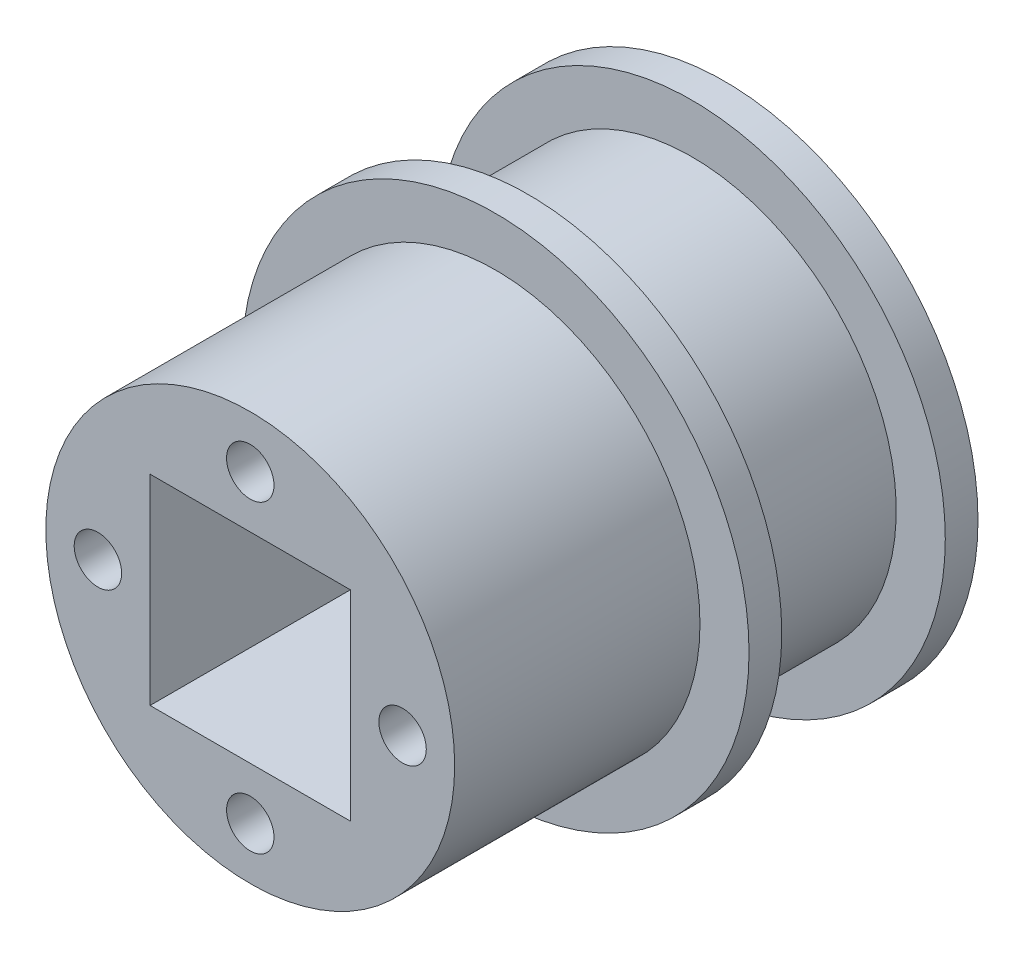
ISO-10303-21;
HEADER;
FILE_DESCRIPTION(('STEP AP214'),'2;1');
FILE_NAME('part.step','',(''),(''),'','','');
FILE_SCHEMA(('AUTOMOTIVE_DESIGN { 1 0 10303 214 1 1 1 1 }'));
ENDSEC;
DATA;
#1=APPLICATION_CONTEXT('core data for automotive mechanical design processes');
#2=APPLICATION_PROTOCOL_DEFINITION('international standard','automotive_design',2000,#1);
#3=PRODUCT_CONTEXT('',#1,'mechanical');
#4=PRODUCT('Part','Part','',(#3));
#5=PRODUCT_RELATED_PRODUCT_CATEGORY('part','',(#4));
#6=PRODUCT_DEFINITION_FORMATION('','',#4);
#7=PRODUCT_DEFINITION_CONTEXT('part definition',#1,'design');
#8=PRODUCT_DEFINITION('design','',#6,#7);
#9=PRODUCT_DEFINITION_SHAPE('','',#8);
#10=(LENGTH_UNIT() NAMED_UNIT(*) SI_UNIT(.MILLI.,.METRE.));
#11=(NAMED_UNIT(*) PLANE_ANGLE_UNIT() SI_UNIT($,.RADIAN.));
#12=(NAMED_UNIT(*) SI_UNIT($,.STERADIAN.) SOLID_ANGLE_UNIT());
#13=UNCERTAINTY_MEASURE_WITH_UNIT(LENGTH_MEASURE(1.E-05),#10,'distance_accuracy_value','');
#14=(GEOMETRIC_REPRESENTATION_CONTEXT(3) GLOBAL_UNCERTAINTY_ASSIGNED_CONTEXT((#13)) GLOBAL_UNIT_ASSIGNED_CONTEXT((#10,
#11,#12)) REPRESENTATION_CONTEXT('',''));
#15=CARTESIAN_POINT('',(0.,0.,0.));
#16=DIRECTION('',(0.,0.,1.));
#17=DIRECTION('',(1.,0.,0.));
#18=AXIS2_PLACEMENT_3D('',#15,#16,#17);
#19=CARTESIAN_POINT('',(0.,0.,7.5));
#20=DIRECTION('',(0.,0.,-1.));
#21=DIRECTION('',(-1.,0.,0.));
#22=AXIS2_PLACEMENT_3D('',#19,#20,#21);
#23=CYLINDRICAL_SURFACE('',#22,12.5);
#24=CARTESIAN_POINT('',(0.,0.,7.5));
#25=DIRECTION('',(0.,0.,1.));
#26=DIRECTION('',(1.,0.,0.));
#27=AXIS2_PLACEMENT_3D('',#24,#25,#26);
#28=CIRCLE('',#27,12.5);
#29=CARTESIAN_POINT('',(12.5,0.,7.5));
#30=VERTEX_POINT('',#29);
#31=EDGE_CURVE('E42',#30,#30,#28,.T.);
#32=ORIENTED_EDGE('',*,*,#31,.F.);
#33=EDGE_LOOP('',(#32));
#34=FACE_BOUND('',#33,.T.);
#35=CARTESIAN_POINT('',(0.,0.,-7.5));
#36=DIRECTION('',(0.,0.,1.));
#37=DIRECTION('',(1.,0.,0.));
#38=AXIS2_PLACEMENT_3D('',#35,#36,#37);
#39=CIRCLE('',#38,12.5);
#40=CARTESIAN_POINT('',(12.5,0.,-7.5));
#41=VERTEX_POINT('',#40);
#42=EDGE_CURVE('E37',#41,#41,#39,.T.);
#43=ORIENTED_EDGE('',*,*,#42,.T.);
#44=EDGE_LOOP('',(#43));
#45=FACE_BOUND('',#44,.T.);
#46=ADVANCED_FACE('F34',(#34,#45),#23,.T.);
#47=CARTESIAN_POINT('',(0.,0.,7.5));
#48=DIRECTION('',(0.,0.,1.));
#49=DIRECTION('',(1.,0.,0.));
#50=AXIS2_PLACEMENT_3D('',#47,#48,#49);
#51=PLANE('',#50);
#52=CARTESIAN_POINT('',(9.315,0.,7.5));
#53=DIRECTION('',(0.,0.,1.));
#54=DIRECTION('',(1.,0.,0.));
#55=AXIS2_PLACEMENT_3D('',#52,#53,#54);
#56=CIRCLE('',#55,1.45);
#57=CARTESIAN_POINT('',(10.765,0.,7.5));
#58=VERTEX_POINT('',#57);
#59=EDGE_CURVE('E308',#58,#58,#56,.T.);
#60=ORIENTED_EDGE('',*,*,#59,.F.);
#61=EDGE_LOOP('',(#60));
#62=FACE_BOUND('',#61,.T.);
#63=CARTESIAN_POINT('',(0.,-9.315,7.5));
#64=DIRECTION('',(0.,0.,1.));
#65=DIRECTION('',(1.,0.,0.));
#66=AXIS2_PLACEMENT_3D('',#63,#64,#65);
#67=CIRCLE('',#66,1.45);
#68=CARTESIAN_POINT('',(1.44999999999997,-9.315,7.5));
#69=VERTEX_POINT('',#68);
#70=EDGE_CURVE('E328',#69,#69,#67,.T.);
#71=ORIENTED_EDGE('',*,*,#70,.F.);
#72=EDGE_LOOP('',(#71));
#73=FACE_BOUND('',#72,.T.);
#74=CARTESIAN_POINT('',(-9.315,0.,7.5));
#75=DIRECTION('',(0.,0.,1.));
#76=DIRECTION('',(1.,0.,0.));
#77=AXIS2_PLACEMENT_3D('',#74,#75,#76);
#78=CIRCLE('',#77,1.45);
#79=CARTESIAN_POINT('',(-7.865,0.,7.5));
#80=VERTEX_POINT('',#79);
#81=EDGE_CURVE('E322',#80,#80,#78,.T.);
#82=ORIENTED_EDGE('',*,*,#81,.F.);
#83=EDGE_LOOP('',(#82));
#84=FACE_BOUND('',#83,.T.);
#85=CARTESIAN_POINT('',(0.,9.315,7.5));
#86=DIRECTION('',(0.,0.,1.));
#87=DIRECTION('',(1.,0.,0.));
#88=AXIS2_PLACEMENT_3D('',#85,#86,#87);
#89=CIRCLE('',#88,1.45);
#90=CARTESIAN_POINT('',(1.4500000000001,9.315,7.5));
#91=VERTEX_POINT('',#90);
#92=EDGE_CURVE('E316',#91,#91,#89,.T.);
#93=ORIENTED_EDGE('',*,*,#92,.F.);
#94=EDGE_LOOP('',(#93));
#95=FACE_BOUND('',#94,.T.);
#96=DIRECTION('',(0.,1.,0.));
#97=VECTOR('',#96,1.);
#98=CARTESIAN_POINT('',(6.125,6.125,7.5));
#99=LINE('',#98,#97);
#100=CARTESIAN_POINT('',(6.125,-6.125,7.5));
#101=VERTEX_POINT('',#100);
#102=CARTESIAN_POINT('',(6.125,6.125,7.5));
#103=VERTEX_POINT('',#102);
#104=EDGE_CURVE('E50',#101,#103,#99,.T.);
#105=ORIENTED_EDGE('',*,*,#104,.F.);
#106=DIRECTION('',(1.,0.,0.));
#107=VECTOR('',#106,1.);
#108=CARTESIAN_POINT('',(-6.125,-6.125,7.5));
#109=LINE('',#108,#107);
#110=CARTESIAN_POINT('',(-6.125,-6.125,7.5));
#111=VERTEX_POINT('',#110);
#112=EDGE_CURVE('E88',#111,#101,#109,.T.);
#113=ORIENTED_EDGE('',*,*,#112,.F.);
#114=DIRECTION('',(0.,-1.,0.));
#115=VECTOR('',#114,1.);
#116=CARTESIAN_POINT('',(-6.125,6.125,7.5));
#117=LINE('',#116,#115);
#118=CARTESIAN_POINT('',(-6.125,6.125,7.5));
#119=VERTEX_POINT('',#118);
#120=EDGE_CURVE('E102',#119,#111,#117,.T.);
#121=ORIENTED_EDGE('',*,*,#120,.F.);
#122=DIRECTION('',(-1.,0.,0.));
#123=VECTOR('',#122,1.);
#124=CARTESIAN_POINT('',(-6.125,6.125,7.5));
#125=LINE('',#124,#123);
#126=EDGE_CURVE('E95',#103,#119,#125,.T.);
#127=ORIENTED_EDGE('',*,*,#126,.F.);
#128=EDGE_LOOP('',(#105,#113,#121,#127));
#129=FACE_BOUND('',#128,.T.);
#130=ORIENTED_EDGE('',*,*,#31,.T.);
#131=EDGE_LOOP('',(#130));
#132=FACE_BOUND('',#131,.T.);
#133=ADVANCED_FACE('F141',(#62,#73,#84,#95,#129,#132),#51,.T.);
#134=CARTESIAN_POINT('',(0.,0.,-9.5));
#135=DIRECTION('',(0.,0.,1.));
#136=DIRECTION('',(1.,0.,0.));
#137=AXIS2_PLACEMENT_3D('',#134,#135,#136);
#138=CYLINDRICAL_SURFACE('',#137,15.5);
#139=CARTESIAN_POINT('',(0.,0.,-9.5));
#140=DIRECTION('',(0.,0.,-1.));
#141=DIRECTION('',(-1.,0.,0.));
#142=AXIS2_PLACEMENT_3D('',#139,#140,#141);
#143=CIRCLE('',#142,15.5);
#144=CARTESIAN_POINT('',(-15.5,0.,-9.5));
#145=VERTEX_POINT('',#144);
#146=EDGE_CURVE('E120',#145,#145,#143,.T.);
#147=ORIENTED_EDGE('',*,*,#146,.F.);
#148=EDGE_LOOP('',(#147));
#149=FACE_BOUND('',#148,.T.);
#150=CARTESIAN_POINT('',(0.,0.,-7.5));
#151=DIRECTION('',(0.,0.,-1.));
#152=DIRECTION('',(-1.,0.,0.));
#153=AXIS2_PLACEMENT_3D('',#150,#151,#152);
#154=CIRCLE('',#153,15.5);
#155=CARTESIAN_POINT('',(-15.5,0.,-7.5));
#156=VERTEX_POINT('',#155);
#157=EDGE_CURVE('E118',#156,#156,#154,.T.);
#158=ORIENTED_EDGE('',*,*,#157,.T.);
#159=EDGE_LOOP('',(#158));
#160=FACE_BOUND('',#159,.T.);
#161=ADVANCED_FACE('F139',(#149,#160),#138,.T.);
#162=CARTESIAN_POINT('',(0.,0.,-9.5));
#163=DIRECTION('',(0.,0.,-1.));
#164=DIRECTION('',(-1.,0.,0.));
#165=AXIS2_PLACEMENT_3D('',#162,#163,#164);
#166=PLANE('',#165);
#167=CARTESIAN_POINT('',(0.,0.,-9.5));
#168=DIRECTION('',(0.,0.,-1.));
#169=DIRECTION('',(-1.,0.,0.));
#170=AXIS2_PLACEMENT_3D('',#167,#168,#169);
#171=CIRCLE('',#170,12.5);
#172=CARTESIAN_POINT('',(-12.5,0.,-9.5));
#173=VERTEX_POINT('',#172);
#174=EDGE_CURVE('E11',#173,#173,#171,.T.);
#175=ORIENTED_EDGE('',*,*,#174,.F.);
#176=EDGE_LOOP('',(#175));
#177=FACE_BOUND('',#176,.T.);
#178=ORIENTED_EDGE('',*,*,#146,.T.);
#179=EDGE_LOOP('',(#178));
#180=FACE_BOUND('',#179,.T.);
#181=ADVANCED_FACE('F135',(#177,#180),#166,.T.);
#182=CARTESIAN_POINT('',(0.,0.,-7.5));
#183=DIRECTION('',(0.,0.,-1.));
#184=DIRECTION('',(-1.,0.,0.));
#185=AXIS2_PLACEMENT_3D('',#182,#183,#184);
#186=PLANE('',#185);
#187=ORIENTED_EDGE('',*,*,#42,.F.);
#188=EDGE_LOOP('',(#187));
#189=FACE_BOUND('',#188,.T.);
#190=ORIENTED_EDGE('',*,*,#157,.F.);
#191=EDGE_LOOP('',(#190));
#192=FACE_BOUND('',#191,.T.);
#193=ADVANCED_FACE('F131',(#189,#192),#186,.F.);
#194=CARTESIAN_POINT('',(0.,0.,-19.5));
#195=DIRECTION('',(0.,0.,1.));
#196=DIRECTION('',(1.,0.,0.));
#197=AXIS2_PLACEMENT_3D('',#194,#195,#196);
#198=CYLINDRICAL_SURFACE('',#197,12.5);
#199=CARTESIAN_POINT('',(0.,0.,-19.5));
#200=DIRECTION('',(0.,0.,-1.));
#201=DIRECTION('',(-1.,0.,0.));
#202=AXIS2_PLACEMENT_3D('',#199,#200,#201);
#203=CIRCLE('',#202,12.5);
#204=CARTESIAN_POINT('',(-12.5,0.,-19.5));
#205=VERTEX_POINT('',#204);
#206=EDGE_CURVE('E114',#205,#205,#203,.T.);
#207=ORIENTED_EDGE('',*,*,#206,.F.);
#208=EDGE_LOOP('',(#207));
#209=FACE_BOUND('',#208,.T.);
#210=ORIENTED_EDGE('',*,*,#174,.T.);
#211=EDGE_LOOP('',(#210));
#212=FACE_BOUND('',#211,.T.);
#213=ADVANCED_FACE('F134',(#209,#212),#198,.T.);
#214=CARTESIAN_POINT('',(0.,0.,-21.5));
#215=DIRECTION('',(0.,0.,1.));
#216=DIRECTION('',(1.,0.,0.));
#217=AXIS2_PLACEMENT_3D('',#214,#215,#216);
#218=CYLINDRICAL_SURFACE('',#217,15.5);
#219=CARTESIAN_POINT('',(0.,0.,-21.5));
#220=DIRECTION('',(0.,0.,-1.));
#221=DIRECTION('',(-1.,0.,0.));
#222=AXIS2_PLACEMENT_3D('',#219,#220,#221);
#223=CIRCLE('',#222,15.5);
#224=CARTESIAN_POINT('',(-15.5,0.,-21.5));
#225=VERTEX_POINT('',#224);
#226=EDGE_CURVE('E111',#225,#225,#223,.T.);
#227=ORIENTED_EDGE('',*,*,#226,.F.);
#228=EDGE_LOOP('',(#227));
#229=FACE_BOUND('',#228,.T.);
#230=CARTESIAN_POINT('',(0.,0.,-19.5));
#231=DIRECTION('',(0.,0.,-1.));
#232=DIRECTION('',(-1.,0.,0.));
#233=AXIS2_PLACEMENT_3D('',#230,#231,#232);
#234=CIRCLE('',#233,15.5);
#235=CARTESIAN_POINT('',(-15.5,0.,-19.5));
#236=VERTEX_POINT('',#235);
#237=EDGE_CURVE('E82',#236,#236,#234,.T.);
#238=ORIENTED_EDGE('',*,*,#237,.T.);
#239=EDGE_LOOP('',(#238));
#240=FACE_BOUND('',#239,.T.);
#241=ADVANCED_FACE('F176',(#229,#240),#218,.T.);
#242=CARTESIAN_POINT('',(0.,0.,-21.5));
#243=DIRECTION('',(0.,0.,-1.));
#244=DIRECTION('',(-1.,0.,0.));
#245=AXIS2_PLACEMENT_3D('',#242,#243,#244);
#246=PLANE('',#245);
#247=CARTESIAN_POINT('',(9.315,0.,-21.5));
#248=DIRECTION('',(0.,0.,-1.));
#249=DIRECTION('',(-1.,0.,0.));
#250=AXIS2_PLACEMENT_3D('',#247,#248,#249);
#251=CIRCLE('',#250,1.45);
#252=CARTESIAN_POINT('',(7.865,0.,-21.5));
#253=VERTEX_POINT('',#252);
#254=EDGE_CURVE('E310',#253,#253,#251,.F.);
#255=ORIENTED_EDGE('',*,*,#254,.T.);
#256=EDGE_LOOP('',(#255));
#257=FACE_BOUND('',#256,.T.);
#258=CARTESIAN_POINT('',(0.,-9.315,-21.5));
#259=DIRECTION('',(0.,0.,-1.));
#260=DIRECTION('',(-1.,0.,0.));
#261=AXIS2_PLACEMENT_3D('',#258,#259,#260);
#262=CIRCLE('',#261,1.45);
#263=CARTESIAN_POINT('',(-1.45000000000003,-9.315,-21.5));
#264=VERTEX_POINT('',#263);
#265=EDGE_CURVE('E325',#264,#264,#262,.F.);
#266=ORIENTED_EDGE('',*,*,#265,.T.);
#267=EDGE_LOOP('',(#266));
#268=FACE_BOUND('',#267,.T.);
#269=CARTESIAN_POINT('',(-9.315,0.,-21.5));
#270=DIRECTION('',(0.,0.,-1.));
#271=DIRECTION('',(-1.,0.,0.));
#272=AXIS2_PLACEMENT_3D('',#269,#270,#271);
#273=CIRCLE('',#272,1.45);
#274=CARTESIAN_POINT('',(-10.765,0.,-21.5));
#275=VERTEX_POINT('',#274);
#276=EDGE_CURVE('E319',#275,#275,#273,.F.);
#277=ORIENTED_EDGE('',*,*,#276,.T.);
#278=EDGE_LOOP('',(#277));
#279=FACE_BOUND('',#278,.T.);
#280=CARTESIAN_POINT('',(0.,9.315,-21.5));
#281=DIRECTION('',(0.,0.,-1.));
#282=DIRECTION('',(-1.,0.,0.));
#283=AXIS2_PLACEMENT_3D('',#280,#281,#282);
#284=CIRCLE('',#283,1.45);
#285=CARTESIAN_POINT('',(-1.4499999999999,9.315,-21.5));
#286=VERTEX_POINT('',#285);
#287=EDGE_CURVE('E313',#286,#286,#284,.F.);
#288=ORIENTED_EDGE('',*,*,#287,.T.);
#289=EDGE_LOOP('',(#288));
#290=FACE_BOUND('',#289,.T.);
#291=DIRECTION('',(0.,1.,0.));
#292=VECTOR('',#291,1.);
#293=CARTESIAN_POINT('',(6.125,6.125,-21.5));
#294=LINE('',#293,#292);
#295=CARTESIAN_POINT('',(6.125,-6.125,-21.5));
#296=VERTEX_POINT('',#295);
#297=CARTESIAN_POINT('',(6.125,6.125,-21.5));
#298=VERTEX_POINT('',#297);
#299=EDGE_CURVE('E86',#296,#298,#294,.T.);
#300=ORIENTED_EDGE('',*,*,#299,.T.);
#301=DIRECTION('',(-1.,0.,0.));
#302=VECTOR('',#301,1.);
#303=CARTESIAN_POINT('',(-6.125,6.125,-21.5));
#304=LINE('',#303,#302);
#305=CARTESIAN_POINT('',(-6.125,6.125,-21.5));
#306=VERTEX_POINT('',#305);
#307=EDGE_CURVE('E75',#298,#306,#304,.T.);
#308=ORIENTED_EDGE('',*,*,#307,.T.);
#309=DIRECTION('',(0.,-1.,0.));
#310=VECTOR('',#309,1.);
#311=CARTESIAN_POINT('',(-6.125,6.125,-21.5));
#312=LINE('',#311,#310);
#313=CARTESIAN_POINT('',(-6.125,-6.125,-21.5));
#314=VERTEX_POINT('',#313);
#315=EDGE_CURVE('E97',#306,#314,#312,.T.);
#316=ORIENTED_EDGE('',*,*,#315,.T.);
#317=DIRECTION('',(1.,0.,0.));
#318=VECTOR('',#317,1.);
#319=CARTESIAN_POINT('',(-6.125,-6.125,-21.5));
#320=LINE('',#319,#318);
#321=EDGE_CURVE('E93',#314,#296,#320,.T.);
#322=ORIENTED_EDGE('',*,*,#321,.T.);
#323=EDGE_LOOP('',(#300,#308,#316,#322));
#324=FACE_BOUND('',#323,.T.);
#325=ORIENTED_EDGE('',*,*,#226,.T.);
#326=EDGE_LOOP('',(#325));
#327=FACE_BOUND('',#326,.T.);
#328=ADVANCED_FACE('F91',(#257,#268,#279,#290,#324,#327),#246,.T.);
#329=CARTESIAN_POINT('',(0.,0.,-19.5));
#330=DIRECTION('',(0.,0.,-1.));
#331=DIRECTION('',(-1.,0.,0.));
#332=AXIS2_PLACEMENT_3D('',#329,#330,#331);
#333=PLANE('',#332);
#334=ORIENTED_EDGE('',*,*,#206,.T.);
#335=EDGE_LOOP('',(#334));
#336=FACE_BOUND('',#335,.T.);
#337=ORIENTED_EDGE('',*,*,#237,.F.);
#338=EDGE_LOOP('',(#337));
#339=FACE_BOUND('',#338,.T.);
#340=ADVANCED_FACE('F175',(#336,#339),#333,.F.);
#341=CARTESIAN_POINT('',(6.125,6.125,-21.501));
#342=DIRECTION('',(1.,0.,0.));
#343=DIRECTION('',(0.,1.,0.));
#344=AXIS2_PLACEMENT_3D('',#341,#342,#343);
#345=PLANE('',#344);
#346=DIRECTION('',(0.,0.,1.));
#347=VECTOR('',#346,1.);
#348=CARTESIAN_POINT('',(6.125,-6.125,-21.501));
#349=LINE('',#348,#347);
#350=EDGE_CURVE('E83',#296,#101,#349,.T.);
#351=ORIENTED_EDGE('',*,*,#350,.T.);
#352=ORIENTED_EDGE('',*,*,#104,.T.);
#353=DIRECTION('',(0.,0.,1.));
#354=VECTOR('',#353,1.);
#355=CARTESIAN_POINT('',(6.125,6.125,-21.501));
#356=LINE('',#355,#354);
#357=EDGE_CURVE('E77',#298,#103,#356,.T.);
#358=ORIENTED_EDGE('',*,*,#357,.F.);
#359=ORIENTED_EDGE('',*,*,#299,.F.);
#360=EDGE_LOOP('',(#351,#352,#358,#359));
#361=FACE_BOUND('',#360,.T.);
#362=ADVANCED_FACE('F85',(#361),#345,.F.);
#363=CARTESIAN_POINT('',(-6.125,-6.125,-21.501));
#364=DIRECTION('',(0.,-1.,0.));
#365=DIRECTION('',(0.,0.,-1.));
#366=AXIS2_PLACEMENT_3D('',#363,#364,#365);
#367=PLANE('',#366);
#368=DIRECTION('',(0.,0.,1.));
#369=VECTOR('',#368,1.);
#370=CARTESIAN_POINT('',(-6.125,-6.125,-21.501));
#371=LINE('',#370,#369);
#372=EDGE_CURVE('E108',#314,#111,#371,.T.);
#373=ORIENTED_EDGE('',*,*,#372,.T.);
#374=ORIENTED_EDGE('',*,*,#112,.T.);
#375=ORIENTED_EDGE('',*,*,#350,.F.);
#376=ORIENTED_EDGE('',*,*,#321,.F.);
#377=EDGE_LOOP('',(#373,#374,#375,#376));
#378=FACE_BOUND('',#377,.T.);
#379=ADVANCED_FACE('F228',(#378),#367,.F.);
#380=CARTESIAN_POINT('',(-6.125,6.125,-21.501));
#381=DIRECTION('',(-1.,0.,0.));
#382=DIRECTION('',(0.,-1.,0.));
#383=AXIS2_PLACEMENT_3D('',#380,#381,#382);
#384=PLANE('',#383);
#385=DIRECTION('',(0.,0.,1.));
#386=VECTOR('',#385,1.);
#387=CARTESIAN_POINT('',(-6.125,6.125,-21.501));
#388=LINE('',#387,#386);
#389=EDGE_CURVE('E58',#306,#119,#388,.T.);
#390=ORIENTED_EDGE('',*,*,#389,.T.);
#391=ORIENTED_EDGE('',*,*,#120,.T.);
#392=ORIENTED_EDGE('',*,*,#372,.F.);
#393=ORIENTED_EDGE('',*,*,#315,.F.);
#394=EDGE_LOOP('',(#390,#391,#392,#393));
#395=FACE_BOUND('',#394,.T.);
#396=ADVANCED_FACE('F231',(#395),#384,.F.);
#397=CARTESIAN_POINT('',(-6.125,6.125,-21.501));
#398=DIRECTION('',(0.,1.,0.));
#399=DIRECTION('',(0.,0.,1.));
#400=AXIS2_PLACEMENT_3D('',#397,#398,#399);
#401=PLANE('',#400);
#402=ORIENTED_EDGE('',*,*,#357,.T.);
#403=ORIENTED_EDGE('',*,*,#126,.T.);
#404=ORIENTED_EDGE('',*,*,#389,.F.);
#405=ORIENTED_EDGE('',*,*,#307,.F.);
#406=EDGE_LOOP('',(#402,#403,#404,#405));
#407=FACE_BOUND('',#406,.T.);
#408=ADVANCED_FACE('F76',(#407),#401,.F.);
#409=CARTESIAN_POINT('',(0.,9.315,-21.501));
#410=DIRECTION('',(0.,0.,1.));
#411=DIRECTION('',(1.,0.,0.));
#412=AXIS2_PLACEMENT_3D('',#409,#410,#411);
#413=CYLINDRICAL_SURFACE('',#412,1.45);
#414=ORIENTED_EDGE('',*,*,#287,.F.);
#415=EDGE_LOOP('',(#414));
#416=FACE_BOUND('',#415,.T.);
#417=ORIENTED_EDGE('',*,*,#92,.T.);
#418=EDGE_LOOP('',(#417));
#419=FACE_BOUND('',#418,.T.);
#420=ADVANCED_FACE('F186',(#416,#419),#413,.F.);
#421=CARTESIAN_POINT('',(-9.315,0.,-21.501));
#422=DIRECTION('',(0.,0.,1.));
#423=DIRECTION('',(1.,0.,0.));
#424=AXIS2_PLACEMENT_3D('',#421,#422,#423);
#425=CYLINDRICAL_SURFACE('',#424,1.45);
#426=ORIENTED_EDGE('',*,*,#276,.F.);
#427=EDGE_LOOP('',(#426));
#428=FACE_BOUND('',#427,.T.);
#429=ORIENTED_EDGE('',*,*,#81,.T.);
#430=EDGE_LOOP('',(#429));
#431=FACE_BOUND('',#430,.T.);
#432=ADVANCED_FACE('F191',(#428,#431),#425,.F.);
#433=CARTESIAN_POINT('',(0.,-9.315,-21.501));
#434=DIRECTION('',(0.,0.,1.));
#435=DIRECTION('',(1.,0.,0.));
#436=AXIS2_PLACEMENT_3D('',#433,#434,#435);
#437=CYLINDRICAL_SURFACE('',#436,1.45);
#438=ORIENTED_EDGE('',*,*,#265,.F.);
#439=EDGE_LOOP('',(#438));
#440=FACE_BOUND('',#439,.T.);
#441=ORIENTED_EDGE('',*,*,#70,.T.);
#442=EDGE_LOOP('',(#441));
#443=FACE_BOUND('',#442,.T.);
#444=ADVANCED_FACE('F201',(#440,#443),#437,.F.);
#445=CARTESIAN_POINT('',(9.315,0.,-21.501));
#446=DIRECTION('',(0.,0.,1.));
#447=DIRECTION('',(1.,0.,0.));
#448=AXIS2_PLACEMENT_3D('',#445,#446,#447);
#449=CYLINDRICAL_SURFACE('',#448,1.45);
#450=ORIENTED_EDGE('',*,*,#254,.F.);
#451=EDGE_LOOP('',(#450));
#452=FACE_BOUND('',#451,.T.);
#453=ORIENTED_EDGE('',*,*,#59,.T.);
#454=EDGE_LOOP('',(#453));
#455=FACE_BOUND('',#454,.T.);
#456=ADVANCED_FACE('F211',(#452,#455),#449,.F.);
#457=CLOSED_SHELL('',(#46,#133,#161,#181,#193,#213,#241,#328,#340,#362,#379,#396,#408,#420,#432,
#444,#456));
#458=MANIFOLD_SOLID_BREP('B2',#457);
#459=ADVANCED_BREP_SHAPE_REPRESENTATION('',(#18,#458),#14);
#460=SHAPE_DEFINITION_REPRESENTATION(#9,#459);
ENDSEC;
END-ISO-10303-21;
